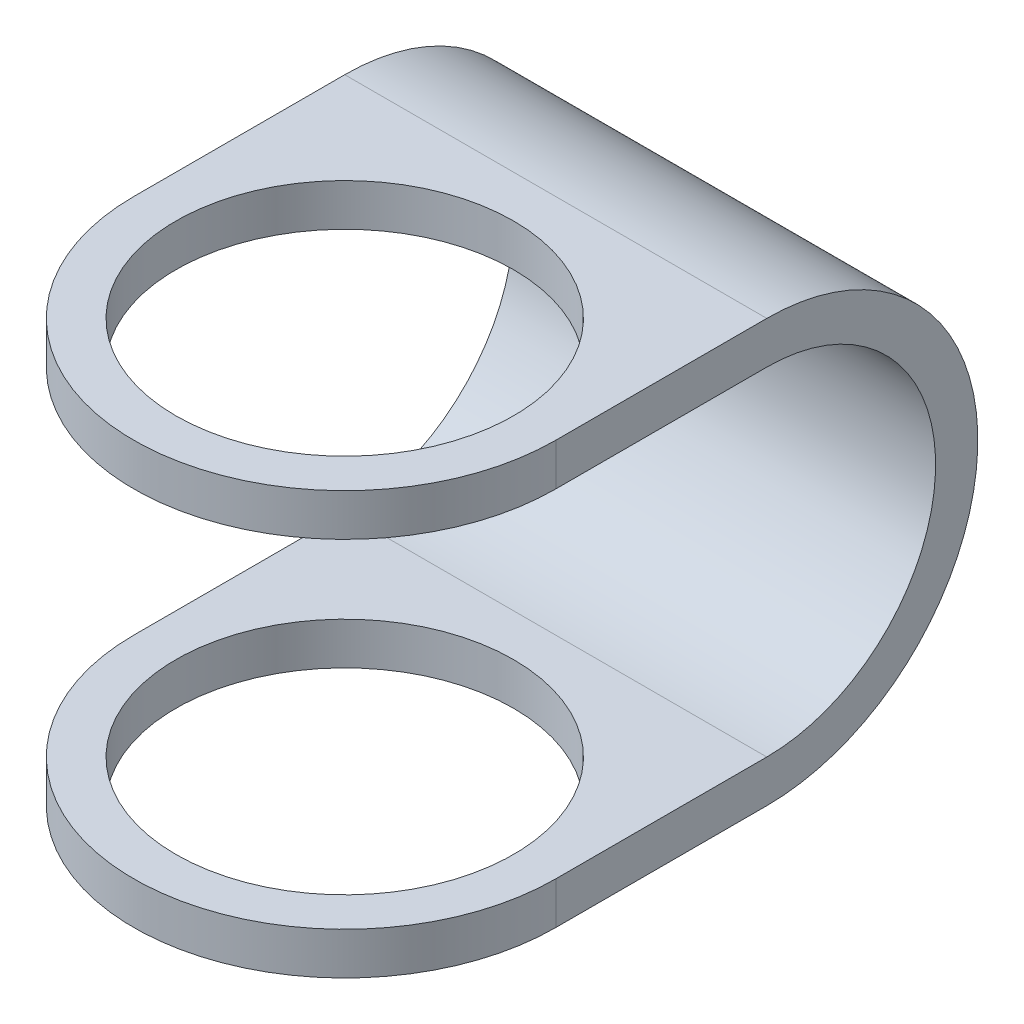
ISO-10303-21;
HEADER;
FILE_DESCRIPTION(('STEP AP214'),'2;1');
FILE_NAME('part.step','',(''),(''),'','','');
FILE_SCHEMA(('AUTOMOTIVE_DESIGN { 1 0 10303 214 1 1 1 1 }'));
ENDSEC;
DATA;
#1=APPLICATION_CONTEXT('core data for automotive mechanical design processes');
#2=APPLICATION_PROTOCOL_DEFINITION('international standard','automotive_design',2000,#1);
#3=PRODUCT_CONTEXT('',#1,'mechanical');
#4=PRODUCT('Part','Part','',(#3));
#5=PRODUCT_RELATED_PRODUCT_CATEGORY('part','',(#4));
#6=PRODUCT_DEFINITION_FORMATION('','',#4);
#7=PRODUCT_DEFINITION_CONTEXT('part definition',#1,'design');
#8=PRODUCT_DEFINITION('design','',#6,#7);
#9=PRODUCT_DEFINITION_SHAPE('','',#8);
#10=(LENGTH_UNIT() NAMED_UNIT(*) SI_UNIT(.MILLI.,.METRE.));
#11=(NAMED_UNIT(*) PLANE_ANGLE_UNIT() SI_UNIT($,.RADIAN.));
#12=(NAMED_UNIT(*) SI_UNIT($,.STERADIAN.) SOLID_ANGLE_UNIT());
#13=UNCERTAINTY_MEASURE_WITH_UNIT(LENGTH_MEASURE(1.E-05),#10,'distance_accuracy_value','');
#14=(GEOMETRIC_REPRESENTATION_CONTEXT(3) GLOBAL_UNCERTAINTY_ASSIGNED_CONTEXT((#13)) GLOBAL_UNIT_ASSIGNED_CONTEXT((#10,
#11,#12)) REPRESENTATION_CONTEXT('',''));
#15=CARTESIAN_POINT('',(0.,0.,0.));
#16=DIRECTION('',(0.,0.,1.));
#17=DIRECTION('',(1.,0.,0.));
#18=AXIS2_PLACEMENT_3D('',#15,#16,#17);
#19=CARTESIAN_POINT('',(50.,10.,-50.));
#20=DIRECTION('',(0.,-1.,0.));
#21=DIRECTION('',(0.,0.,-1.));
#22=AXIS2_PLACEMENT_3D('',#19,#20,#21);
#23=CYLINDRICAL_SURFACE('',#22,50.);
#24=DIRECTION('',(0.,1.,0.));
#25=VECTOR('',#24,1.);
#26=CARTESIAN_POINT('',(100.,10.,-50.));
#27=LINE('',#26,#25);
#28=CARTESIAN_POINT('',(100.,10.,-50.));
#29=VERTEX_POINT('',#28);
#30=CARTESIAN_POINT('',(100.,0.,-50.));
#31=VERTEX_POINT('',#30);
#32=EDGE_CURVE('E163',#29,#31,#27,.F.);
#33=ORIENTED_EDGE('',*,*,#32,.F.);
#34=CARTESIAN_POINT('',(50.,10.,-50.));
#35=DIRECTION('',(0.,-1.,0.));
#36=DIRECTION('',(0.,0.,-1.));
#37=AXIS2_PLACEMENT_3D('',#34,#35,#36);
#38=CIRCLE('',#37,50.);
#39=CARTESIAN_POINT('',(0.,10.,-50.));
#40=VERTEX_POINT('',#39);
#41=EDGE_CURVE('E44',#40,#29,#38,.F.);
#42=ORIENTED_EDGE('',*,*,#41,.F.);
#43=DIRECTION('',(0.,-1.,0.));
#44=VECTOR('',#43,1.);
#45=CARTESIAN_POINT('',(0.,50.,-50.));
#46=LINE('',#45,#44);
#47=CARTESIAN_POINT('',(0.,0.,-50.));
#48=VERTEX_POINT('',#47);
#49=EDGE_CURVE('E166',#48,#40,#46,.F.);
#50=ORIENTED_EDGE('',*,*,#49,.F.);
#51=CARTESIAN_POINT('',(50.,0.,-50.));
#52=DIRECTION('',(0.,1.,0.));
#53=DIRECTION('',(0.,0.,1.));
#54=AXIS2_PLACEMENT_3D('',#51,#52,#53);
#55=CIRCLE('',#54,50.);
#56=EDGE_CURVE('E11',#31,#48,#55,.F.);
#57=ORIENTED_EDGE('',*,*,#56,.F.);
#58=EDGE_LOOP('',(#33,#42,#50,#57));
#59=FACE_BOUND('',#58,.T.);
#60=ADVANCED_FACE('F35',(#59),#23,.T.);
#61=CARTESIAN_POINT('',(50.,100.,-50.));
#62=DIRECTION('',(0.,-1.,0.));
#63=DIRECTION('',(0.,0.,-1.));
#64=AXIS2_PLACEMENT_3D('',#61,#62,#63);
#65=CYLINDRICAL_SURFACE('',#64,50.);
#66=DIRECTION('',(0.,1.,0.));
#67=VECTOR('',#66,1.);
#68=CARTESIAN_POINT('',(100.,100.,-50.));
#69=LINE('',#68,#67);
#70=CARTESIAN_POINT('',(100.,100.,-50.));
#71=VERTEX_POINT('',#70);
#72=CARTESIAN_POINT('',(100.,90.,-50.));
#73=VERTEX_POINT('',#72);
#74=EDGE_CURVE('E155',#71,#73,#69,.F.);
#75=ORIENTED_EDGE('',*,*,#74,.F.);
#76=CARTESIAN_POINT('',(50.,100.,-50.));
#77=DIRECTION('',(0.,-1.,0.));
#78=DIRECTION('',(0.,0.,-1.));
#79=AXIS2_PLACEMENT_3D('',#76,#77,#78);
#80=CIRCLE('',#79,50.);
#81=CARTESIAN_POINT('',(0.,100.,-50.));
#82=VERTEX_POINT('',#81);
#83=EDGE_CURVE('E160',#82,#71,#80,.F.);
#84=ORIENTED_EDGE('',*,*,#83,.F.);
#85=DIRECTION('',(0.,-1.,0.));
#86=VECTOR('',#85,1.);
#87=CARTESIAN_POINT('',(0.,50.,-50.));
#88=LINE('',#87,#86);
#89=CARTESIAN_POINT('',(0.,90.,-50.));
#90=VERTEX_POINT('',#89);
#91=EDGE_CURVE('E158',#90,#82,#88,.F.);
#92=ORIENTED_EDGE('',*,*,#91,.F.);
#93=CARTESIAN_POINT('',(50.,90.,-50.));
#94=DIRECTION('',(0.,1.,0.));
#95=DIRECTION('',(0.,0.,1.));
#96=AXIS2_PLACEMENT_3D('',#93,#94,#95);
#97=CIRCLE('',#96,50.);
#98=EDGE_CURVE('E116',#73,#90,#97,.F.);
#99=ORIENTED_EDGE('',*,*,#98,.F.);
#100=EDGE_LOOP('',(#75,#84,#92,#99));
#101=FACE_BOUND('',#100,.T.);
#102=ADVANCED_FACE('F176',(#101),#65,.T.);
#103=CARTESIAN_POINT('',(100.,0.,0.));
#104=DIRECTION('',(0.,1.,0.));
#105=DIRECTION('',(0.,0.,1.));
#106=AXIS2_PLACEMENT_3D('',#103,#104,#105);
#107=PLANE('',#106);
#108=CARTESIAN_POINT('',(50.,0.,-50.));
#109=DIRECTION('',(0.,1.,0.));
#110=DIRECTION('',(0.,0.,1.));
#111=AXIS2_PLACEMENT_3D('',#108,#109,#110);
#112=CIRCLE('',#111,40.);
#113=CARTESIAN_POINT('',(50.,0.,-10.));
#114=VERTEX_POINT('',#113);
#115=EDGE_CURVE('E283',#114,#114,#112,.T.);
#116=ORIENTED_EDGE('',*,*,#115,.T.);
#117=EDGE_LOOP('',(#116));
#118=FACE_BOUND('',#117,.T.);
#119=DIRECTION('',(0.,0.,-1.));
#120=VECTOR('',#119,1.);
#121=CARTESIAN_POINT('',(100.,0.,0.));
#122=LINE('',#121,#120);
#123=CARTESIAN_POINT('',(100.,0.,-100.));
#124=VERTEX_POINT('',#123);
#125=EDGE_CURVE('E135',#31,#124,#122,.T.);
#126=ORIENTED_EDGE('',*,*,#125,.F.);
#127=ORIENTED_EDGE('',*,*,#56,.T.);
#128=DIRECTION('',(0.,0.,-1.));
#129=VECTOR('',#128,1.);
#130=CARTESIAN_POINT('',(0.,0.,0.));
#131=LINE('',#130,#129);
#132=CARTESIAN_POINT('',(0.,0.,-100.));
#133=VERTEX_POINT('',#132);
#134=EDGE_CURVE('E110',#48,#133,#131,.T.);
#135=ORIENTED_EDGE('',*,*,#134,.T.);
#136=DIRECTION('',(-1.,0.,0.));
#137=VECTOR('',#136,1.);
#138=CARTESIAN_POINT('',(100.,0.,-100.));
#139=LINE('',#138,#137);
#140=EDGE_CURVE('E151',#124,#133,#139,.T.);
#141=ORIENTED_EDGE('',*,*,#140,.F.);
#142=EDGE_LOOP('',(#126,#127,#135,#141));
#143=FACE_BOUND('',#142,.T.);
#144=ADVANCED_FACE('F186',(#118,#143),#107,.F.);
#145=CARTESIAN_POINT('',(100.,50.,-100.));
#146=DIRECTION('',(-1.,0.,0.));
#147=DIRECTION('',(0.,0.,1.));
#148=AXIS2_PLACEMENT_3D('',#145,#146,#147);
#149=CYLINDRICAL_SURFACE('',#148,50.);
#150=CARTESIAN_POINT('',(0.,50.,-100.));
#151=DIRECTION('',(1.,0.,0.));
#152=DIRECTION('',(0.,0.,-1.));
#153=AXIS2_PLACEMENT_3D('',#150,#151,#152);
#154=CIRCLE('',#153,50.);
#155=CARTESIAN_POINT('',(0.,100.,-100.));
#156=VERTEX_POINT('',#155);
#157=EDGE_CURVE('E145',#133,#156,#154,.T.);
#158=ORIENTED_EDGE('',*,*,#157,.T.);
#159=DIRECTION('',(-1.,0.,0.));
#160=VECTOR('',#159,1.);
#161=CARTESIAN_POINT('',(100.,100.,-100.));
#162=LINE('',#161,#160);
#163=CARTESIAN_POINT('',(100.,100.,-100.));
#164=VERTEX_POINT('',#163);
#165=EDGE_CURVE('E143',#164,#156,#162,.T.);
#166=ORIENTED_EDGE('',*,*,#165,.F.);
#167=CARTESIAN_POINT('',(100.,50.,-100.));
#168=DIRECTION('',(1.,0.,0.));
#169=DIRECTION('',(0.,0.,-1.));
#170=AXIS2_PLACEMENT_3D('',#167,#168,#169);
#171=CIRCLE('',#170,50.);
#172=EDGE_CURVE('E137',#124,#164,#171,.T.);
#173=ORIENTED_EDGE('',*,*,#172,.F.);
#174=ORIENTED_EDGE('',*,*,#140,.T.);
#175=EDGE_LOOP('',(#158,#166,#173,#174));
#176=FACE_BOUND('',#175,.T.);
#177=ADVANCED_FACE('F184',(#176),#149,.T.);
#178=CARTESIAN_POINT('',(100.,100.,0.));
#179=DIRECTION('',(0.,-1.,0.));
#180=DIRECTION('',(0.,0.,-1.));
#181=AXIS2_PLACEMENT_3D('',#178,#179,#180);
#182=PLANE('',#181);
#183=CARTESIAN_POINT('',(50.,100.,-50.));
#184=DIRECTION('',(0.,1.,0.));
#185=DIRECTION('',(0.,0.,1.));
#186=AXIS2_PLACEMENT_3D('',#183,#184,#185);
#187=CIRCLE('',#186,40.);
#188=CARTESIAN_POINT('',(50.,100.,-10.));
#189=VERTEX_POINT('',#188);
#190=EDGE_CURVE('E279',#189,#189,#187,.T.);
#191=ORIENTED_EDGE('',*,*,#190,.F.);
#192=EDGE_LOOP('',(#191));
#193=FACE_BOUND('',#192,.T.);
#194=DIRECTION('',(0.,0.,1.));
#195=VECTOR('',#194,1.);
#196=CARTESIAN_POINT('',(0.,100.,0.));
#197=LINE('',#196,#195);
#198=EDGE_CURVE('E138',#156,#82,#197,.T.);
#199=ORIENTED_EDGE('',*,*,#198,.T.);
#200=ORIENTED_EDGE('',*,*,#83,.T.);
#201=DIRECTION('',(0.,0.,1.));
#202=VECTOR('',#201,1.);
#203=CARTESIAN_POINT('',(100.,100.,0.));
#204=LINE('',#203,#202);
#205=EDGE_CURVE('E140',#164,#71,#204,.T.);
#206=ORIENTED_EDGE('',*,*,#205,.F.);
#207=ORIENTED_EDGE('',*,*,#165,.T.);
#208=EDGE_LOOP('',(#199,#200,#206,#207));
#209=FACE_BOUND('',#208,.T.);
#210=ADVANCED_FACE('F180',(#193,#209),#182,.F.);
#211=CARTESIAN_POINT('',(100.,50.,-100.));
#212=DIRECTION('',(1.,0.,0.));
#213=DIRECTION('',(0.,0.,-1.));
#214=AXIS2_PLACEMENT_3D('',#211,#212,#213);
#215=PLANE('',#214);
#216=DIRECTION('',(0.,0.,-1.));
#217=VECTOR('',#216,1.);
#218=CARTESIAN_POINT('',(100.,10.,26.438322174361));
#219=LINE('',#218,#217);
#220=CARTESIAN_POINT('',(100.,10.,-100.));
#221=VERTEX_POINT('',#220);
#222=EDGE_CURVE('E131',#29,#221,#219,.T.);
#223=ORIENTED_EDGE('',*,*,#222,.F.);
#224=ORIENTED_EDGE('',*,*,#32,.T.);
#225=ORIENTED_EDGE('',*,*,#125,.T.);
#226=ORIENTED_EDGE('',*,*,#172,.T.);
#227=ORIENTED_EDGE('',*,*,#205,.T.);
#228=ORIENTED_EDGE('',*,*,#74,.T.);
#229=DIRECTION('',(0.,0.,1.));
#230=VECTOR('',#229,1.);
#231=CARTESIAN_POINT('',(100.,90.,-100.));
#232=LINE('',#231,#230);
#233=CARTESIAN_POINT('',(100.,90.,-100.));
#234=VERTEX_POINT('',#233);
#235=EDGE_CURVE('E129',#234,#73,#232,.T.);
#236=ORIENTED_EDGE('',*,*,#235,.F.);
#237=CARTESIAN_POINT('',(100.,50.,-100.));
#238=DIRECTION('',(1.,0.,0.));
#239=DIRECTION('',(0.,0.,-1.));
#240=AXIS2_PLACEMENT_3D('',#237,#238,#239);
#241=CIRCLE('',#240,40.);
#242=EDGE_CURVE('E106',#221,#234,#241,.T.);
#243=ORIENTED_EDGE('',*,*,#242,.F.);
#244=EDGE_LOOP('',(#223,#224,#225,#226,#227,#228,#236,#243));
#245=FACE_BOUND('',#244,.T.);
#246=ADVANCED_FACE('F172',(#245),#215,.T.);
#247=CARTESIAN_POINT('',(0.,50.,-100.));
#248=DIRECTION('',(1.,0.,0.));
#249=DIRECTION('',(0.,0.,-1.));
#250=AXIS2_PLACEMENT_3D('',#247,#248,#249);
#251=PLANE('',#250);
#252=ORIENTED_EDGE('',*,*,#134,.F.);
#253=ORIENTED_EDGE('',*,*,#49,.T.);
#254=DIRECTION('',(0.,0.,-1.));
#255=VECTOR('',#254,1.);
#256=CARTESIAN_POINT('',(0.,10.,-100.));
#257=LINE('',#256,#255);
#258=CARTESIAN_POINT('',(0.,10.,-100.));
#259=VERTEX_POINT('',#258);
#260=EDGE_CURVE('E124',#40,#259,#257,.T.);
#261=ORIENTED_EDGE('',*,*,#260,.T.);
#262=CARTESIAN_POINT('',(0.,50.,-100.));
#263=DIRECTION('',(1.,0.,0.));
#264=DIRECTION('',(0.,0.,-1.));
#265=AXIS2_PLACEMENT_3D('',#262,#263,#264);
#266=CIRCLE('',#265,40.);
#267=CARTESIAN_POINT('',(0.,90.,-100.));
#268=VERTEX_POINT('',#267);
#269=EDGE_CURVE('E103',#259,#268,#266,.T.);
#270=ORIENTED_EDGE('',*,*,#269,.T.);
#271=DIRECTION('',(0.,0.,1.));
#272=VECTOR('',#271,1.);
#273=CARTESIAN_POINT('',(0.,90.,-100.));
#274=LINE('',#273,#272);
#275=EDGE_CURVE('E114',#268,#90,#274,.T.);
#276=ORIENTED_EDGE('',*,*,#275,.T.);
#277=ORIENTED_EDGE('',*,*,#91,.T.);
#278=ORIENTED_EDGE('',*,*,#198,.F.);
#279=ORIENTED_EDGE('',*,*,#157,.F.);
#280=EDGE_LOOP('',(#252,#253,#261,#270,#276,#277,#278,#279));
#281=FACE_BOUND('',#280,.T.);
#282=ADVANCED_FACE('F122',(#281),#251,.F.);
#283=CARTESIAN_POINT('',(0.,90.,-100.));
#284=DIRECTION('',(0.,1.,0.));
#285=DIRECTION('',(0.,0.,1.));
#286=AXIS2_PLACEMENT_3D('',#283,#284,#285);
#287=PLANE('',#286);
#288=CARTESIAN_POINT('',(50.,90.,-50.));
#289=DIRECTION('',(0.,1.,0.));
#290=DIRECTION('',(0.,0.,1.));
#291=AXIS2_PLACEMENT_3D('',#288,#289,#290);
#292=CIRCLE('',#291,40.);
#293=CARTESIAN_POINT('',(50.,90.,-10.));
#294=VERTEX_POINT('',#293);
#295=EDGE_CURVE('E132',#294,#294,#292,.T.);
#296=ORIENTED_EDGE('',*,*,#295,.T.);
#297=EDGE_LOOP('',(#296));
#298=FACE_BOUND('',#297,.T.);
#299=ORIENTED_EDGE('',*,*,#235,.T.);
#300=ORIENTED_EDGE('',*,*,#98,.T.);
#301=ORIENTED_EDGE('',*,*,#275,.F.);
#302=DIRECTION('',(1.,0.,0.));
#303=VECTOR('',#302,1.);
#304=CARTESIAN_POINT('',(0.,90.,-100.));
#305=LINE('',#304,#303);
#306=EDGE_CURVE('E98',#268,#234,#305,.T.);
#307=ORIENTED_EDGE('',*,*,#306,.T.);
#308=EDGE_LOOP('',(#299,#300,#301,#307));
#309=FACE_BOUND('',#308,.T.);
#310=ADVANCED_FACE('F115',(#298,#309),#287,.F.);
#311=CARTESIAN_POINT('',(0.,10.,26.438322174361));
#312=DIRECTION('',(0.,-1.,0.));
#313=DIRECTION('',(0.,0.,-1.));
#314=AXIS2_PLACEMENT_3D('',#311,#312,#313);
#315=PLANE('',#314);
#316=CARTESIAN_POINT('',(50.,10.,-50.));
#317=DIRECTION('',(0.,-1.,0.));
#318=DIRECTION('',(0.,0.,-1.));
#319=AXIS2_PLACEMENT_3D('',#316,#317,#318);
#320=CIRCLE('',#319,40.);
#321=CARTESIAN_POINT('',(50.,10.,-90.));
#322=VERTEX_POINT('',#321);
#323=EDGE_CURVE('E39',#322,#322,#320,.T.);
#324=ORIENTED_EDGE('',*,*,#323,.T.);
#325=EDGE_LOOP('',(#324));
#326=FACE_BOUND('',#325,.T.);
#327=ORIENTED_EDGE('',*,*,#260,.F.);
#328=ORIENTED_EDGE('',*,*,#41,.T.);
#329=ORIENTED_EDGE('',*,*,#222,.T.);
#330=DIRECTION('',(1.,0.,0.));
#331=VECTOR('',#330,1.);
#332=CARTESIAN_POINT('',(0.,10.,-100.));
#333=LINE('',#332,#331);
#334=EDGE_CURVE('E111',#259,#221,#333,.T.);
#335=ORIENTED_EDGE('',*,*,#334,.F.);
#336=EDGE_LOOP('',(#327,#328,#329,#335));
#337=FACE_BOUND('',#336,.T.);
#338=ADVANCED_FACE('F169',(#326,#337),#315,.F.);
#339=CARTESIAN_POINT('',(0.,50.,-100.));
#340=DIRECTION('',(1.,0.,0.));
#341=DIRECTION('',(0.,0.,-1.));
#342=AXIS2_PLACEMENT_3D('',#339,#340,#341);
#343=CYLINDRICAL_SURFACE('',#342,40.);
#344=ORIENTED_EDGE('',*,*,#242,.T.);
#345=ORIENTED_EDGE('',*,*,#306,.F.);
#346=ORIENTED_EDGE('',*,*,#269,.F.);
#347=ORIENTED_EDGE('',*,*,#334,.T.);
#348=EDGE_LOOP('',(#344,#345,#346,#347));
#349=FACE_BOUND('',#348,.T.);
#350=ADVANCED_FACE('F100',(#349),#343,.F.);
#351=CARTESIAN_POINT('',(50.,0.,-50.));
#352=DIRECTION('',(0.,1.,0.));
#353=DIRECTION('',(0.,0.,1.));
#354=AXIS2_PLACEMENT_3D('',#351,#352,#353);
#355=CYLINDRICAL_SURFACE('',#354,40.);
#356=ORIENTED_EDGE('',*,*,#115,.F.);
#357=EDGE_LOOP('',(#356));
#358=FACE_BOUND('',#357,.T.);
#359=ORIENTED_EDGE('',*,*,#323,.F.);
#360=EDGE_LOOP('',(#359));
#361=FACE_BOUND('',#360,.T.);
#362=ADVANCED_FACE('F213',(#358,#361),#355,.F.);
#363=ORIENTED_EDGE('',*,*,#190,.T.);
#364=EDGE_LOOP('',(#363));
#365=FACE_BOUND('',#364,.T.);
#366=ORIENTED_EDGE('',*,*,#295,.F.);
#367=EDGE_LOOP('',(#366));
#368=FACE_BOUND('',#367,.T.);
#369=ADVANCED_FACE('F263',(#365,#368),#355,.F.);
#370=CLOSED_SHELL('',(#60,#102,#144,#177,#210,#246,#282,#310,#338,#350,#362,#369));
#371=MANIFOLD_SOLID_BREP('B2',#370);
#372=ADVANCED_BREP_SHAPE_REPRESENTATION('',(#18,#371),#14);
#373=SHAPE_DEFINITION_REPRESENTATION(#9,#372);
ENDSEC;
END-ISO-10303-21;
